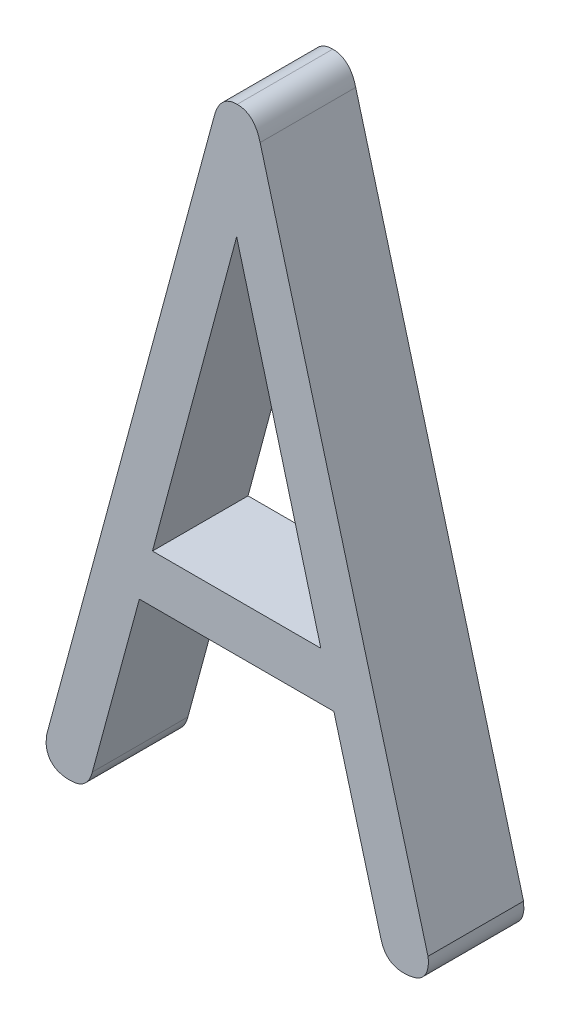
ISO-10303-21;
HEADER;
FILE_DESCRIPTION(('STEP AP214'),'2;1');
FILE_NAME('part.step','',(''),(''),'','','');
FILE_SCHEMA(('AUTOMOTIVE_DESIGN { 1 0 10303 214 1 1 1 1 }'));
ENDSEC;
DATA;
#1=APPLICATION_CONTEXT('core data for automotive mechanical design processes');
#2=APPLICATION_PROTOCOL_DEFINITION('international standard','automotive_design',2000,#1);
#3=PRODUCT_CONTEXT('',#1,'mechanical');
#4=PRODUCT('Part','Part','',(#3));
#5=PRODUCT_RELATED_PRODUCT_CATEGORY('part','',(#4));
#6=PRODUCT_DEFINITION_FORMATION('','',#4);
#7=PRODUCT_DEFINITION_CONTEXT('part definition',#1,'design');
#8=PRODUCT_DEFINITION('design','',#6,#7);
#9=PRODUCT_DEFINITION_SHAPE('','',#8);
#10=(LENGTH_UNIT() NAMED_UNIT(*) SI_UNIT(.MILLI.,.METRE.));
#11=(NAMED_UNIT(*) PLANE_ANGLE_UNIT() SI_UNIT($,.RADIAN.));
#12=(NAMED_UNIT(*) SI_UNIT($,.STERADIAN.) SOLID_ANGLE_UNIT());
#13=UNCERTAINTY_MEASURE_WITH_UNIT(LENGTH_MEASURE(1.E-05),#10,'distance_accuracy_value','');
#14=(GEOMETRIC_REPRESENTATION_CONTEXT(3) GLOBAL_UNCERTAINTY_ASSIGNED_CONTEXT((#13)) GLOBAL_UNIT_ASSIGNED_CONTEXT((#10,
#11,#12)) REPRESENTATION_CONTEXT('',''));
#15=CARTESIAN_POINT('',(0.,0.,0.));
#16=DIRECTION('',(0.,0.,1.));
#17=DIRECTION('',(1.,0.,0.));
#18=AXIS2_PLACEMENT_3D('',#15,#16,#17);
#19=CARTESIAN_POINT('',(0.,0.,-0.1));
#20=DIRECTION('',(0.,0.,1.));
#21=DIRECTION('',(1.,0.,0.));
#22=AXIS2_PLACEMENT_3D('',#19,#20,#21);
#23=PLANE('',#22);
#24=DIRECTION('',(0.261903540202846,0.965094055327882,0.));
#25=VECTOR('',#24,1.);
#26=CARTESIAN_POINT('',(20.1106650390394,-17.8358804040573,-0.1));
#27=LINE('',#26,#25);
#28=CARTESIAN_POINT('',(20.1106650390394,-17.8358804040573,-0.1));
#29=VERTEX_POINT('',#28);
#30=CARTESIAN_POINT('',(20.1598750390394,-17.6545454040573,-0.1));
#31=VERTEX_POINT('',#30);
#32=EDGE_CURVE('E164',#29,#31,#27,.T.);
#33=ORIENTED_EDGE('',*,*,#32,.F.);
#34=CARTESIAN_POINT('',(20.1106650390394,-17.8358804040573,-0.1));
#35=CARTESIAN_POINT('',(20.110253619552,-17.8374563353685,-0.1));
#36=CARTESIAN_POINT('',(20.1097585789858,-17.8390194229056,-0.1));
#37=CARTESIAN_POINT('',(20.108532581737,-17.8420789013523,-0.1));
#38=CARTESIAN_POINT('',(20.1077977575629,-17.8435737066957,-0.1));
#39=CARTESIAN_POINT('',(20.1056862930101,-17.846952963104,-0.1));
#40=CARTESIAN_POINT('',(20.1041708798908,-17.8487592820702,-0.1));
#41=CARTESIAN_POINT('',(20.1005757527915,-17.8517136238384,-0.1));
#42=CARTESIAN_POINT('',(20.0984938587695,-17.8528590489901,-0.1));
#43=CARTESIAN_POINT('',(20.094863887115,-17.8541397479878,-0.1));
#44=CARTESIAN_POINT('',(20.0933814192367,-17.8544876638293,-0.1));
#45=CARTESIAN_POINT('',(20.0903927115968,-17.8549282606182,-0.1));
#46=CARTESIAN_POINT('',(20.0888868736959,-17.8550235323658,-0.1));
#47=CARTESIAN_POINT('',(20.0873900390394,-17.8550254040573,-0.1));
#48=B_SPLINE_CURVE_WITH_KNOTS('',3,(#34,#35,#36,#37,#38,#39,#40,#41,#42,#43,#44,#45,#46,#47),
.UNSPECIFIED.,.F.,.F.,(4,2,2,2,2,2,4),(0.,0.00489593289724349,0.00987509630168829,
0.0168135520722736,0.0237790969314097,0.0283263346560344,0.0328267579917053),.UNSPECIFIED.);
#49=CARTESIAN_POINT('',(20.0873900390394,-17.8550254040573,-0.1));
#50=VERTEX_POINT('',#49);
#51=EDGE_CURVE('E176',#29,#50,#48,.T.);
#52=ORIENTED_EDGE('',*,*,#51,.T.);
#53=CARTESIAN_POINT('',(20.0873900390394,-17.8550254040573,-0.1));
#54=CARTESIAN_POINT('',(20.0852298062539,-17.8550148694073,-0.1));
#55=CARTESIAN_POINT('',(20.083030667278,-17.8548885285468,-0.1));
#56=CARTESIAN_POINT('',(20.0786515543959,-17.8542159421212,-0.1));
#57=CARTESIAN_POINT('',(20.0764732186483,-17.8536599891219,-0.1));
#58=CARTESIAN_POINT('',(20.0724715026934,-17.851975339587,-0.1));
#59=CARTESIAN_POINT('',(20.0706346470294,-17.850883147428,-0.1));
#60=CARTESIAN_POINT('',(20.0674671155835,-17.8480995101172,-0.1));
#61=CARTESIAN_POINT('',(20.0661384816064,-17.8464056993797,-0.1));
#62=CARTESIAN_POINT('',(20.0638918910791,-17.8423014546028,-0.1));
#63=CARTESIAN_POINT('',(20.063122212447,-17.8398152294405,-0.1));
#64=CARTESIAN_POINT('',(20.0623552595867,-17.8355446149797,-0.1));
#65=CARTESIAN_POINT('',(20.0621932427029,-17.8337795165057,-0.1));
#66=CARTESIAN_POINT('',(20.0621152346911,-17.8311454974348,-0.1));
#67=CARTESIAN_POINT('',(20.0621159033885,-17.8302787136915,-0.1));
#68=CARTESIAN_POINT('',(20.0621241695021,-17.8285462062788,-0.1));
#69=CARTESIAN_POINT('',(20.0621317582252,-17.8276804826436,-0.1));
#70=CARTESIAN_POINT('',(20.0621200390394,-17.8268154040573,-0.1));
#71=B_SPLINE_CURVE_WITH_KNOTS('',3,(#53,#54,#55,#56,#57,#58,#59,#60,#61,#62,#63,#64,#65,#66,#67,
#68,#69,#70),.UNSPECIFIED.,.F.,.F.,(4,2,2,2,2,2,2,2,4),(0.,0.00654059190832742,
0.0132334570773786,0.0195233027432859,0.0258381591979918,0.0335014709844825,0.038808154833169,
0.04140792847835,0.0440044407075193),.UNSPECIFIED.);
#72=CARTESIAN_POINT('',(20.0626100390394,-17.8268154040573,-0.1));
#73=VERTEX_POINT('',#72);
#74=EDGE_CURVE('E214',#50,#73,#71,.T.);
#75=ORIENTED_EDGE('',*,*,#74,.T.);
#76=DIRECTION('',(-0.261850708185428,-0.965108391126504,0.));
#77=VECTOR('',#76,1.);
#78=CARTESIAN_POINT('',(20.2382225390394,-17.1775479040573,-0.1));
#79=LINE('',#78,#77);
#80=CARTESIAN_POINT('',(20.2382225390394,-17.1775479040573,-0.1));
#81=VERTEX_POINT('',#80);
#82=EDGE_CURVE('E180',#81,#73,#79,.T.);
#83=ORIENTED_EDGE('',*,*,#82,.F.);
#84=CARTESIAN_POINT('',(20.2382225390394,-17.1775479040573,-0.1));
#85=CARTESIAN_POINT('',(20.2392771319383,-17.1734731389393,-0.1));
#86=CARTESIAN_POINT('',(20.2408877114756,-17.16917801034,-0.1));
#87=CARTESIAN_POINT('',(20.2446488760711,-17.1633337321534,-0.1));
#88=CARTESIAN_POINT('',(20.2462745534382,-17.1613954989765,-0.1));
#89=CARTESIAN_POINT('',(20.2491699612069,-17.15899032813,-0.1));
#90=CARTESIAN_POINT('',(20.2502173571279,-17.1582700850096,-0.1));
#91=CARTESIAN_POINT('',(20.2524350794429,-17.1570419929953,-0.1));
#92=CARTESIAN_POINT('',(20.2536059224604,-17.1565350849027,-0.1));
#93=CARTESIAN_POINT('',(20.2560085887822,-17.15574982955,-0.1));
#94=CARTESIAN_POINT('',(20.2572397927617,-17.1554695317049,-0.1));
#95=CARTESIAN_POINT('',(20.2597267478246,-17.1551065889253,-0.1));
#96=CARTESIAN_POINT('',(20.2609823813303,-17.1550231596254,-0.1));
#97=CARTESIAN_POINT('',(20.2622325390394,-17.1550254040573,-0.1));
#98=B_SPLINE_CURVE_WITH_KNOTS('',3,(#84,#85,#86,#87,#88,#89,#90,#91,#92,#93,#94,#95,#96,#97),
.UNSPECIFIED.,.F.,.F.,(4,2,2,2,2,2,4),(0.,0.0131013214293937,0.0206037974132024,
0.0243913711162785,0.0281954771881149,0.0319664793386956,0.035722431474066),.UNSPECIFIED.);
#99=CARTESIAN_POINT('',(20.2622325390394,-17.1550254040573,-0.1));
#100=VERTEX_POINT('',#99);
#101=EDGE_CURVE('E183',#81,#100,#98,.T.);
#102=ORIENTED_EDGE('',*,*,#101,.T.);
#103=CARTESIAN_POINT('',(20.2622325390394,-17.1550254040573,-0.1));
#104=CARTESIAN_POINT('',(20.2634988803877,-17.1550264201773,-0.1));
#105=CARTESIAN_POINT('',(20.2647693988123,-17.1551107414599,-0.1));
#106=CARTESIAN_POINT('',(20.2672832576649,-17.1554813477658,-0.1));
#107=CARTESIAN_POINT('',(20.2685265095693,-17.1557682120668,-0.1));
#108=CARTESIAN_POINT('',(20.2721560469159,-17.1569872002523,-0.1));
#109=CARTESIAN_POINT('',(20.2744360472493,-17.1582780352938,-0.1));
#110=CARTESIAN_POINT('',(20.2781144146828,-17.1613825127454,-0.1));
#111=CARTESIAN_POINT('',(20.2795852516271,-17.1631160455485,-0.1));
#112=CARTESIAN_POINT('',(20.2831002327065,-17.168363449883,-0.1));
#113=CARTESIAN_POINT('',(20.2846543184006,-17.1721880039859,-0.1));
#114=CARTESIAN_POINT('',(20.285953905302,-17.1766107396209,-0.1));
#115=CARTESIAN_POINT('',(20.286101621992,-17.1771404022241,-0.1));
#116=CARTESIAN_POINT('',(20.2862425390394,-17.1776704040573,-0.1));
#117=B_SPLINE_CURVE_WITH_KNOTS('',3,(#103,#104,#105,#106,#107,#108,#109,#110,#111,#112,#113,
#114,#115,#116),.UNSPECIFIED.,.F.,.F.,(4,2,2,2,2,2,4),(0.,0.00380161390964727,
0.00761414479348842,0.0152563515518174,0.0219926736752459,0.0341458441735124,
0.0357947586552457),.UNSPECIFIED.);
#118=CARTESIAN_POINT('',(20.2862425390394,-17.1776704040573,-0.1));
#119=VERTEX_POINT('',#118);
#120=EDGE_CURVE('E186',#100,#119,#117,.T.);
#121=ORIENTED_EDGE('',*,*,#120,.T.);
#122=DIRECTION('',(-0.261663187921532,0.965159249081073,0.));
#123=VECTOR('',#122,1.);
#124=CARTESIAN_POINT('',(20.4613300390394,-17.8234904040573,-0.1));
#125=LINE('',#124,#123);
#126=CARTESIAN_POINT('',(20.4618375390394,-17.8272441540573,-0.1));
#127=VERTEX_POINT('',#126);
#128=EDGE_CURVE('E217',#127,#119,#125,.T.);
#129=ORIENTED_EDGE('',*,*,#128,.F.);
#130=CARTESIAN_POINT('',(20.4623450390394,-17.8272441540573,-0.1));
#131=CARTESIAN_POINT('',(20.4623334189568,-17.828202741424,-0.1));
#132=CARTESIAN_POINT('',(20.462343127518,-17.8291620784035,-0.1));
#133=CARTESIAN_POINT('',(20.4623469573402,-17.8310840282883,-0.1));
#134=CARTESIAN_POINT('',(20.4623410231976,-17.8320466407451,-0.1));
#135=CARTESIAN_POINT('',(20.4622095479624,-17.8349719951084,-0.1));
#136=CARTESIAN_POINT('',(20.4619658441171,-17.8369319327547,-0.1));
#137=CARTESIAN_POINT('',(20.4609969666172,-17.8410278824722,-0.1));
#138=CARTESIAN_POINT('',(20.4602115820293,-17.8431522371422,-0.1));
#139=CARTESIAN_POINT('',(20.4579036724689,-17.8470073378161,-0.1));
#140=CARTESIAN_POINT('',(20.4563756392941,-17.848734998281,-0.1));
#141=CARTESIAN_POINT('',(20.4530023387878,-17.8513345684555,-0.1));
#142=CARTESIAN_POINT('',(20.4512109810788,-17.852280086179,-0.1));
#143=CARTESIAN_POINT('',(20.4461864315793,-17.8542008120593,-0.1));
#144=CARTESIAN_POINT('',(20.4428064787639,-17.8547522657958,-0.1));
#145=CARTESIAN_POINT('',(20.4384525303043,-17.8549986788034,-0.1));
#146=CARTESIAN_POINT('',(20.4374718457132,-17.855023690351,-0.1));
#147=CARTESIAN_POINT('',(20.4364975390394,-17.8550254040573,-0.1));
#148=B_SPLINE_CURVE_WITH_KNOTS('',3,(#130,#131,#132,#133,#134,#135,#136,#137,#138,#139,#140,
#141,#142,#143,#144,#145,#146,#147),.UNSPECIFIED.,.F.,.F.,(4,2,2,2,2,2,2,2,4),(0.,
0.00287719821914431,0.00576460064393809,0.0116600137686082,0.0183464029317022,0.025083159660862,
0.03107347383393,0.041169196435357,0.0441066430272821),.UNSPECIFIED.);
#149=CARTESIAN_POINT('',(20.4364975390394,-17.8550254040573,-0.1));
#150=VERTEX_POINT('',#149);
#151=EDGE_CURVE('E91',#127,#150,#148,.T.);
#152=ORIENTED_EDGE('',*,*,#151,.T.);
#153=CARTESIAN_POINT('',(20.4364975390394,-17.8550254040573,-0.1));
#154=CARTESIAN_POINT('',(20.4348293269025,-17.8550237141066,-0.1));
#155=CARTESIAN_POINT('',(20.4331478024926,-17.8549121755159,-0.1));
#156=CARTESIAN_POINT('',(20.4298171988279,-17.8543894936207,-0.1));
#157=CARTESIAN_POINT('',(20.4281686213318,-17.8539753243675,-0.1));
#158=CARTESIAN_POINT('',(20.4244481500918,-17.8525534502684,-0.1));
#159=CARTESIAN_POINT('',(20.4224287770881,-17.8513892744711,-0.1));
#160=CARTESIAN_POINT('',(20.4189360337703,-17.8484468816847,-0.1));
#161=CARTESIAN_POINT('',(20.4174624467612,-17.8466689089362,-0.1));
#162=CARTESIAN_POINT('',(20.4146008454989,-17.8420818841496,-0.1));
#163=CARTESIAN_POINT('',(20.4134252126975,-17.8391301267109,-0.1));
#164=CARTESIAN_POINT('',(20.4126800390394,-17.8361954040573,-0.1));
#165=B_SPLINE_CURVE_WITH_KNOTS('',3,(#153,#154,#155,#156,#157,#158,#159,#160,#161,#162,#163,
#164),.UNSPECIFIED.,.F.,.F.,(4,2,2,2,2,4),(0.,0.0050205333909895,0.0100919652889132,
0.0169295536998718,0.0237644244450069,0.0330032001079443),.UNSPECIFIED.);
#166=CARTESIAN_POINT('',(20.4126800390394,-17.8361954040573,-0.1));
#167=VERTEX_POINT('',#166);
#168=EDGE_CURVE('E24',#150,#167,#165,.T.);
#169=ORIENTED_EDGE('',*,*,#168,.T.);
#170=DIRECTION('',(0.261913518822734,-0.965091347312726,0.));
#171=VECTOR('',#170,1.);
#172=CARTESIAN_POINT('',(20.3633825390394,-17.6545454040573,-0.1));
#173=LINE('',#172,#171);
#174=CARTESIAN_POINT('',(20.3633825390394,-17.6545454040573,-0.1));
#175=VERTEX_POINT('',#174);
#176=EDGE_CURVE('E195',#175,#167,#173,.T.);
#177=ORIENTED_EDGE('',*,*,#176,.F.);
#178=DIRECTION('',(1.,0.,0.));
#179=VECTOR('',#178,1.);
#180=CARTESIAN_POINT('',(20.1598750390394,-17.6545454040573,-0.1));
#181=LINE('',#180,#179);
#182=EDGE_CURVE('E103',#31,#175,#181,.T.);
#183=ORIENTED_EDGE('',*,*,#182,.F.);
#184=EDGE_LOOP('',(#33,#52,#75,#83,#102,#121,#129,#152,#169,#177,#183));
#185=FACE_BOUND('',#184,.T.);
#186=DIRECTION('',(-0.258708678620981,0.965955392140955,0.));
#187=VECTOR('',#186,1.);
#188=CARTESIAN_POINT('',(20.2616550390394,-17.2752854040573,-0.1));
#189=LINE('',#188,#187);
#190=CARTESIAN_POINT('',(20.3497325390394,-17.6041454040573,-0.1));
#191=VERTEX_POINT('',#190);
#192=CARTESIAN_POINT('',(20.2616550390394,-17.2752854040573,-0.1));
#193=VERTEX_POINT('',#192);
#194=EDGE_CURVE('E145',#191,#193,#189,.T.);
#195=ORIENTED_EDGE('',*,*,#194,.T.);
#196=DIRECTION('',(-0.258708678620962,-0.96595539214096,0.));
#197=VECTOR('',#196,1.);
#198=CARTESIAN_POINT('',(20.1735775390394,-17.6041454040573,-0.1));
#199=LINE('',#198,#197);
#200=CARTESIAN_POINT('',(20.1735775390394,-17.6041454040573,-0.1));
#201=VERTEX_POINT('',#200);
#202=EDGE_CURVE('E142',#193,#201,#199,.T.);
#203=ORIENTED_EDGE('',*,*,#202,.T.);
#204=DIRECTION('',(1.,0.,0.));
#205=VECTOR('',#204,1.);
#206=CARTESIAN_POINT('',(20.3497325390394,-17.6041454040573,-0.1));
#207=LINE('',#206,#205);
#208=EDGE_CURVE('E203',#201,#191,#207,.T.);
#209=ORIENTED_EDGE('',*,*,#208,.T.);
#210=EDGE_LOOP('',(#195,#203,#209));
#211=FACE_BOUND('',#210,.T.);
#212=ADVANCED_FACE('F17',(#185,#211),#23,.F.);
#213=CARTESIAN_POINT('',(20.3497325390394,-17.6041454040573,-0.1));
#214=DIRECTION('',(0.,-1.,0.));
#215=DIRECTION('',(0.,0.,-1.));
#216=AXIS2_PLACEMENT_3D('',#213,#214,#215);
#217=PLANE('',#216);
#218=DIRECTION('',(0.,0.,1.));
#219=VECTOR('',#218,1.);
#220=CARTESIAN_POINT('',(20.3497325390394,-17.6041454040573,-0.1));
#221=LINE('',#220,#219);
#222=CARTESIAN_POINT('',(20.3497325390394,-17.6041454040573,0.));
#223=VERTEX_POINT('',#222);
#224=EDGE_CURVE('E152',#223,#191,#221,.F.);
#225=ORIENTED_EDGE('',*,*,#224,.T.);
#226=ORIENTED_EDGE('',*,*,#208,.F.);
#227=DIRECTION('',(0.,0.,1.));
#228=VECTOR('',#227,1.);
#229=CARTESIAN_POINT('',(20.1735775390394,-17.6041454040573,-0.1));
#230=LINE('',#229,#228);
#231=CARTESIAN_POINT('',(20.1735775390394,-17.6041454040573,0.));
#232=VERTEX_POINT('',#231);
#233=EDGE_CURVE('E200',#201,#232,#230,.T.);
#234=ORIENTED_EDGE('',*,*,#233,.T.);
#235=DIRECTION('',(1.,0.,0.));
#236=VECTOR('',#235,1.);
#237=CARTESIAN_POINT('',(0.,-17.6041454040573,0.));
#238=LINE('',#237,#236);
#239=EDGE_CURVE('E157',#223,#232,#238,.F.);
#240=ORIENTED_EDGE('',*,*,#239,.F.);
#241=EDGE_LOOP('',(#225,#226,#234,#240));
#242=FACE_BOUND('',#241,.T.);
#243=ADVANCED_FACE('F304',(#242),#217,.F.);
#244=CARTESIAN_POINT('',(20.1735775390394,-17.6041454040573,-0.1));
#245=DIRECTION('',(-0.96595539214096,0.258708678620962,0.));
#246=DIRECTION('',(-0.258708678620962,-0.96595539214096,0.));
#247=AXIS2_PLACEMENT_3D('',#244,#245,#246);
#248=PLANE('',#247);
#249=ORIENTED_EDGE('',*,*,#233,.F.);
#250=ORIENTED_EDGE('',*,*,#202,.F.);
#251=DIRECTION('',(0.,0.,1.));
#252=VECTOR('',#251,1.);
#253=CARTESIAN_POINT('',(20.2616550390394,-17.2752854040573,-0.1));
#254=LINE('',#253,#252);
#255=CARTESIAN_POINT('',(20.2616550390394,-17.2752854040573,0.));
#256=VERTEX_POINT('',#255);
#257=EDGE_CURVE('E135',#193,#256,#254,.T.);
#258=ORIENTED_EDGE('',*,*,#257,.T.);
#259=DIRECTION('',(0.258708678620975,0.965955392140957,0.));
#260=VECTOR('',#259,1.);
#261=CARTESIAN_POINT('',(20.1735775390394,-17.6041454040573,0.));
#262=LINE('',#261,#260);
#263=EDGE_CURVE('E140',#232,#256,#262,.T.);
#264=ORIENTED_EDGE('',*,*,#263,.F.);
#265=EDGE_LOOP('',(#249,#250,#258,#264));
#266=FACE_BOUND('',#265,.T.);
#267=ADVANCED_FACE('F138',(#266),#248,.F.);
#268=CARTESIAN_POINT('',(20.2616550390394,-17.2752854040573,-0.1));
#269=DIRECTION('',(0.965955392140955,0.258708678620981,0.));
#270=DIRECTION('',(-0.258708678620981,0.965955392140955,0.));
#271=AXIS2_PLACEMENT_3D('',#268,#269,#270);
#272=PLANE('',#271);
#273=ORIENTED_EDGE('',*,*,#257,.F.);
#274=ORIENTED_EDGE('',*,*,#194,.F.);
#275=ORIENTED_EDGE('',*,*,#224,.F.);
#276=DIRECTION('',(0.258708678620975,-0.965955392140957,0.));
#277=VECTOR('',#276,1.);
#278=CARTESIAN_POINT('',(20.2616550390394,-17.2752854040573,0.));
#279=LINE('',#278,#277);
#280=EDGE_CURVE('E149',#256,#223,#279,.T.);
#281=ORIENTED_EDGE('',*,*,#280,.F.);
#282=EDGE_LOOP('',(#273,#274,#275,#281));
#283=FACE_BOUND('',#282,.T.);
#284=ADVANCED_FACE('F150',(#283),#272,.F.);
#285=CARTESIAN_POINT('',(20.1598750390394,-17.6545454040573,-0.1));
#286=DIRECTION('',(0.,-1.,0.));
#287=DIRECTION('',(0.,0.,-1.));
#288=AXIS2_PLACEMENT_3D('',#285,#286,#287);
#289=PLANE('',#288);
#290=ORIENTED_EDGE('',*,*,#182,.T.);
#291=DIRECTION('',(0.,0.,1.));
#292=VECTOR('',#291,1.);
#293=CARTESIAN_POINT('',(20.3633825390394,-17.6545454040573,-0.1));
#294=LINE('',#293,#292);
#295=CARTESIAN_POINT('',(20.3633825390394,-17.6545454040573,0.));
#296=VERTEX_POINT('',#295);
#297=EDGE_CURVE('E192',#296,#175,#294,.F.);
#298=ORIENTED_EDGE('',*,*,#297,.F.);
#299=DIRECTION('',(1.,0.,0.));
#300=VECTOR('',#299,1.);
#301=CARTESIAN_POINT('',(0.,-17.6545454040573,0.));
#302=LINE('',#301,#300);
#303=CARTESIAN_POINT('',(20.1598750390394,-17.6545454040573,0.));
#304=VERTEX_POINT('',#303);
#305=EDGE_CURVE('E154',#304,#296,#302,.T.);
#306=ORIENTED_EDGE('',*,*,#305,.F.);
#307=DIRECTION('',(0.,0.,1.));
#308=VECTOR('',#307,1.);
#309=CARTESIAN_POINT('',(20.1598750390394,-17.6545454040573,-0.1));
#310=LINE('',#309,#308);
#311=EDGE_CURVE('E159',#31,#304,#310,.T.);
#312=ORIENTED_EDGE('',*,*,#311,.F.);
#313=EDGE_LOOP('',(#290,#298,#306,#312));
#314=FACE_BOUND('',#313,.T.);
#315=ADVANCED_FACE('F371',(#314),#289,.T.);
#316=CARTESIAN_POINT('',(20.3633825390394,-17.6545454040573,-0.1));
#317=DIRECTION('',(-0.965091347312726,-0.261913518822734,0.));
#318=DIRECTION('',(0.261913518822734,-0.965091347312726,0.));
#319=AXIS2_PLACEMENT_3D('',#316,#317,#318);
#320=PLANE('',#319);
#321=ORIENTED_EDGE('',*,*,#176,.T.);
#322=DIRECTION('',(0.,0.,1.));
#323=VECTOR('',#322,1.);
#324=CARTESIAN_POINT('',(20.4126800390394,-17.8361954040573,-0.05));
#325=LINE('',#324,#323);
#326=CARTESIAN_POINT('',(20.4126800390394,-17.8361954040573,0.));
#327=VERTEX_POINT('',#326);
#328=EDGE_CURVE('E190',#167,#327,#325,.T.);
#329=ORIENTED_EDGE('',*,*,#328,.T.);
#330=DIRECTION('',(0.261913518822729,-0.965091347312728,0.));
#331=VECTOR('',#330,1.);
#332=CARTESIAN_POINT('',(20.3633825390394,-17.6545454040573,0.));
#333=LINE('',#332,#331);
#334=EDGE_CURVE('E172',#296,#327,#333,.T.);
#335=ORIENTED_EDGE('',*,*,#334,.F.);
#336=ORIENTED_EDGE('',*,*,#297,.T.);
#337=EDGE_LOOP('',(#321,#329,#335,#336));
#338=FACE_BOUND('',#337,.T.);
#339=ADVANCED_FACE('F370',(#338),#320,.T.);
#340=CARTESIAN_POINT('',(20.4126800390394,-17.8361954040573,-0.1));
#341=CARTESIAN_POINT('',(20.4177550390394,-17.8550254040573,-0.1));
#342=CARTESIAN_POINT('',(20.4364975390394,-17.8550254040573,-0.1));
#343=CARTESIAN_POINT('',(20.4126800390394,-17.8361954040573,0.));
#344=CARTESIAN_POINT('',(20.4177550390394,-17.8550254040573,0.));
#345=CARTESIAN_POINT('',(20.4364975390394,-17.8550254040573,0.));
#346=B_SPLINE_SURFACE_WITH_KNOTS('',1,2,((#340,#341,#342),(#343,#344,#345)),.UNSPECIFIED.,.F.,
.F.,.F.,(2,2),(3,3),(0.,1.),(0.,1.),.UNSPECIFIED.);
#347=DIRECTION('',(0.,0.,1.));
#348=VECTOR('',#347,1.);
#349=CARTESIAN_POINT('',(20.4364975390394,-17.8550254040573,-0.05));
#350=LINE('',#349,#348);
#351=CARTESIAN_POINT('',(20.4364975390394,-17.8550254040573,0.));
#352=VERTEX_POINT('',#351);
#353=EDGE_CURVE('E187',#150,#352,#350,.T.);
#354=CARTESIAN_POINT('',(20.4126800390394,-17.8361954040573,0.));
#355=CARTESIAN_POINT('',(20.4131148366523,-17.8377962785117,0.));
#356=CARTESIAN_POINT('',(20.4136422209383,-17.8393830643257,0.));
#357=CARTESIAN_POINT('',(20.414950086615,-17.842474469384,0.));
#358=CARTESIAN_POINT('',(20.4157342653539,-17.8439774883961,0.));
#359=CARTESIAN_POINT('',(20.4179693801817,-17.8473266701374,0.));
#360=CARTESIAN_POINT('',(20.4195603004211,-17.8490878217094,0.));
#361=CARTESIAN_POINT('',(20.4232738462895,-17.8519294217627,0.));
#362=CARTESIAN_POINT('',(20.4253977205605,-17.8530082504555,0.));
#363=CARTESIAN_POINT('',(20.4290588282328,-17.8542048350783,0.));
#364=CARTESIAN_POINT('',(20.4305385131455,-17.8545274133112,0.));
#365=CARTESIAN_POINT('',(20.4335139428493,-17.8549351839945,0.));
#366=CARTESIAN_POINT('',(20.4350092864326,-17.8550231581496,0.));
#367=CARTESIAN_POINT('',(20.4364975390394,-17.8550254040573,0.));
#368=B_SPLINE_CURVE_WITH_KNOTS('',3,(#354,#355,#356,#357,#358,#359,#360,#361,#362,#363,#364,
#365,#366,#367),.UNSPECIFIED.,.F.,.F.,(4,2,2,2,2,2,4),(0.,0.00498912468275578,
0.0100534974503664,0.0170319611891029,0.0240269297556173,0.0285528363750429,0.0330248355606764),.UNSPECIFIED.);
#369=EDGE_CURVE('E269',#327,#352,#368,.T.);
#370=ORIENTED_EDGE('',*,*,#328,.F.);
#371=ORIENTED_EDGE('',*,*,#168,.F.);
#372=ORIENTED_EDGE('',*,*,#353,.T.);
#373=ORIENTED_EDGE('',*,*,#369,.F.);
#374=EDGE_LOOP('',(#370,#371,#372,#373));
#375=FACE_BOUND('',#374,.T.);
#376=ADVANCED_FACE('F280',(#375),#346,.F.);
#377=CARTESIAN_POINT('',(20.4364975390394,-17.8550254040573,-0.1));
#378=CARTESIAN_POINT('',(20.4623450390394,-17.8550254040573,-0.1));
#379=CARTESIAN_POINT('',(20.4623450390394,-17.8309979040573,-0.1));
#380=CARTESIAN_POINT('',(20.4623450390394,-17.8289656028073,-0.1));
#381=CARTESIAN_POINT('',(20.4623450390394,-17.8269333015573,-0.1));
#382=CARTESIAN_POINT('',(20.4364975390394,-17.8550254040573,0.));
#383=CARTESIAN_POINT('',(20.4623450390394,-17.8550254040573,0.));
#384=CARTESIAN_POINT('',(20.4623450390394,-17.8309979040573,0.));
#385=CARTESIAN_POINT('',(20.4623450390394,-17.8289656028073,0.));
#386=CARTESIAN_POINT('',(20.4623450390394,-17.8269333015573,0.));
#387=B_SPLINE_SURFACE_WITH_KNOTS('',1,2,((#377,#378,#379,#380,#381),(#382,#383,#384,#385,#386)),
.UNSPECIFIED.,.F.,.F.,.F.,(2,2),(3,2,3),(0.,1.),(0.,1.,1.08458230152954),.UNSPECIFIED.);
#388=DIRECTION('',(0.,0.,1.));
#389=VECTOR('',#388,1.);
#390=CARTESIAN_POINT('',(20.4623450390394,-17.8272342881153,0.));
#391=LINE('',#390,#389);
#392=CARTESIAN_POINT('',(20.4618375390394,-17.8272441540573,0.));
#393=VERTEX_POINT('',#392);
#394=EDGE_CURVE('E189',#393,#127,#391,.F.);
#395=CARTESIAN_POINT('',(20.4364975390394,-17.8550254040573,0.));
#396=CARTESIAN_POINT('',(20.4402265799229,-17.8550234979573,0.));
#397=CARTESIAN_POINT('',(20.4442713247709,-17.8546451300911,0.));
#398=CARTESIAN_POINT('',(20.4501452015789,-17.8527824265392,0.));
#399=CARTESIAN_POINT('',(20.4521849425388,-17.8518369883298,0.));
#400=CARTESIAN_POINT('',(20.4558310957188,-17.8492427070297,0.));
#401=CARTESIAN_POINT('',(20.4574341821343,-17.8475886993975,0.));
#402=CARTESIAN_POINT('',(20.459764688286,-17.8440302896162,0.));
#403=CARTESIAN_POINT('',(20.4605685759753,-17.8421729090678,0.));
#404=CARTESIAN_POINT('',(20.4616242159664,-17.8386274187496,0.));
#405=CARTESIAN_POINT('',(20.4619414200209,-17.8369566217694,0.));
#406=CARTESIAN_POINT('',(20.4622992092677,-17.8335825850466,0.));
#407=CARTESIAN_POINT('',(20.4623383115757,-17.8318792198759,0.));
#408=CARTESIAN_POINT('',(20.4623489053717,-17.8291980707562,0.));
#409=CARTESIAN_POINT('',(20.4623420786115,-17.8282197956238,0.));
#410=CARTESIAN_POINT('',(20.4623450390394,-17.8272441540573,0.));
#411=B_SPLINE_CURVE_WITH_KNOTS('',3,(#395,#396,#397,#398,#399,#400,#401,#402,#403,#404,#405,
#406,#407,#408,#409,#410),.UNSPECIFIED.,.F.,.F.,(4,2,2,2,2,2,2,4),(0.,0.0116098131736922,
0.0182812397968937,0.0250021425660761,0.0309896165229147,0.0360650434445708,0.0411675132253161,
0.0440999473004294),.UNSPECIFIED.);
#412=EDGE_CURVE('E268',#352,#393,#411,.T.);
#413=ORIENTED_EDGE('',*,*,#353,.F.);
#414=ORIENTED_EDGE('',*,*,#151,.F.);
#415=ORIENTED_EDGE('',*,*,#394,.F.);
#416=ORIENTED_EDGE('',*,*,#412,.F.);
#417=EDGE_LOOP('',(#413,#414,#415,#416));
#418=FACE_BOUND('',#417,.T.);
#419=ADVANCED_FACE('F274',(#418),#387,.F.);
#420=CARTESIAN_POINT('',(20.4613300390394,-17.8234904040573,-0.1));
#421=DIRECTION('',(0.965159249081073,0.261663187921532,0.));
#422=DIRECTION('',(-0.261663187921532,0.965159249081073,0.));
#423=AXIS2_PLACEMENT_3D('',#420,#421,#422);
#424=PLANE('',#423);
#425=ORIENTED_EDGE('',*,*,#128,.T.);
#426=DIRECTION('',(0.,0.,1.));
#427=VECTOR('',#426,1.);
#428=CARTESIAN_POINT('',(20.2862425390394,-17.1776704040573,-0.05));
#429=LINE('',#428,#427);
#430=CARTESIAN_POINT('',(20.2862425390394,-17.1776704040573,0.));
#431=VERTEX_POINT('',#430);
#432=EDGE_CURVE('E184',#119,#431,#429,.T.);
#433=ORIENTED_EDGE('',*,*,#432,.T.);
#434=DIRECTION('',(-0.261663187921531,0.965159249081074,0.));
#435=VECTOR('',#434,1.);
#436=CARTESIAN_POINT('',(20.4613300390394,-17.8234904040573,0.));
#437=LINE('',#436,#435);
#438=EDGE_CURVE('E336',#393,#431,#437,.T.);
#439=ORIENTED_EDGE('',*,*,#438,.F.);
#440=ORIENTED_EDGE('',*,*,#394,.T.);
#441=EDGE_LOOP('',(#425,#433,#439,#440));
#442=FACE_BOUND('',#441,.T.);
#443=ADVANCED_FACE('F279',(#442),#424,.T.);
#444=CARTESIAN_POINT('',(20.2862425390394,-17.1776704040573,-0.1));
#445=CARTESIAN_POINT('',(20.2802400390394,-17.1550254040573,-0.1));
#446=CARTESIAN_POINT('',(20.2622325390394,-17.1550254040573,-0.1));
#447=CARTESIAN_POINT('',(20.2862425390394,-17.1776704040573,0.));
#448=CARTESIAN_POINT('',(20.2802400390394,-17.1550254040573,0.));
#449=CARTESIAN_POINT('',(20.2622325390394,-17.1550254040573,0.));
#450=B_SPLINE_SURFACE_WITH_KNOTS('',1,2,((#444,#445,#446),(#447,#448,#449)),.UNSPECIFIED.,.F.,
.F.,.F.,(2,2),(3,3),(0.,1.),(0.,1.),.UNSPECIFIED.);
#451=DIRECTION('',(0.,0.,1.));
#452=VECTOR('',#451,1.);
#453=CARTESIAN_POINT('',(20.2622325390394,-17.1550254040573,-0.05));
#454=LINE('',#453,#452);
#455=CARTESIAN_POINT('',(20.2622325390394,-17.1550254040573,0.));
#456=VERTEX_POINT('',#455);
#457=EDGE_CURVE('E181',#100,#456,#454,.T.);
#458=CARTESIAN_POINT('',(20.2862425390394,-17.1776704040573,0.));
#459=CARTESIAN_POINT('',(20.2851864131865,-17.1735802794899,0.));
#460=CARTESIAN_POINT('',(20.2835806467206,-17.1692637672436,0.));
#461=CARTESIAN_POINT('',(20.2798249198515,-17.1633904920814,0.));
#462=CARTESIAN_POINT('',(20.2782034527575,-17.1614439701847,0.));
#463=CARTESIAN_POINT('',(20.2753120386315,-17.1590245149504,0.));
#464=CARTESIAN_POINT('',(20.2742654431144,-17.1582991213273,0.));
#465=CARTESIAN_POINT('',(20.2720480007661,-17.1570614806399,0.));
#466=CARTESIAN_POINT('',(20.2708766410219,-17.1565501596816,0.));
#467=CARTESIAN_POINT('',(20.2684710919656,-17.1557574741326,0.));
#468=CARTESIAN_POINT('',(20.2672374883305,-17.1554742807016,0.));
#469=CARTESIAN_POINT('',(20.2647448470386,-17.1551074402772,0.));
#470=CARTESIAN_POINT('',(20.2634859204423,-17.1550230584578,0.));
#471=CARTESIAN_POINT('',(20.2622325390394,-17.1550254040573,0.));
#472=B_SPLINE_CURVE_WITH_KNOTS('',3,(#458,#459,#460,#461,#462,#463,#464,#465,#466,#467,#468,
#469,#470,#471),.UNSPECIFIED.,.F.,.F.,(4,2,2,2,2,2,4),(0.,0.0131535275612983,0.0206675648824021,
0.0244618302820714,0.0282723446616596,0.0320519983170037,0.0358176599582377),.UNSPECIFIED.);
#473=EDGE_CURVE('E256',#431,#456,#472,.T.);
#474=ORIENTED_EDGE('',*,*,#432,.F.);
#475=ORIENTED_EDGE('',*,*,#120,.F.);
#476=ORIENTED_EDGE('',*,*,#457,.T.);
#477=ORIENTED_EDGE('',*,*,#473,.F.);
#478=EDGE_LOOP('',(#474,#475,#476,#477));
#479=FACE_BOUND('',#478,.T.);
#480=ADVANCED_FACE('F285',(#479),#450,.F.);
#481=CARTESIAN_POINT('',(20.2622325390394,-17.1550254040573,-0.1));
#482=CARTESIAN_POINT('',(20.2442250390394,-17.1550254040573,-0.1));
#483=CARTESIAN_POINT('',(20.2382225390394,-17.1775479040573,-0.1));
#484=CARTESIAN_POINT('',(20.2622325390394,-17.1550254040573,0.));
#485=CARTESIAN_POINT('',(20.2442250390394,-17.1550254040573,0.));
#486=CARTESIAN_POINT('',(20.2382225390394,-17.1775479040573,0.));
#487=B_SPLINE_SURFACE_WITH_KNOTS('',1,2,((#481,#482,#483),(#484,#485,#486)),.UNSPECIFIED.,.F.,
.F.,.F.,(2,2),(3,3),(0.,1.),(0.,1.),.UNSPECIFIED.);
#488=DIRECTION('',(0.,0.,1.));
#489=VECTOR('',#488,1.);
#490=CARTESIAN_POINT('',(20.2382225390394,-17.1775479040573,-0.1));
#491=LINE('',#490,#489);
#492=CARTESIAN_POINT('',(20.2382225390394,-17.1775479040573,0.));
#493=VERTEX_POINT('',#492);
#494=EDGE_CURVE('E177',#493,#81,#491,.F.);
#495=CARTESIAN_POINT('',(20.2622325390394,-17.1550254040573,0.));
#496=CARTESIAN_POINT('',(20.2609614511358,-17.1550264836686,0.));
#497=CARTESIAN_POINT('',(20.2596861468546,-17.1551109371531,0.));
#498=CARTESIAN_POINT('',(20.2571626073059,-17.1554824721884,0.));
#499=CARTESIAN_POINT('',(20.2559144647489,-17.1557701610124,0.));
#500=CARTESIAN_POINT('',(20.252270526231,-17.1569934732458,0.));
#501=CARTESIAN_POINT('',(20.2499813822339,-17.1582896666304,0.));
#502=CARTESIAN_POINT('',(20.246294283264,-17.1614056491104,0.));
#503=CARTESIAN_POINT('',(20.2448222184402,-17.1631436209981,0.));
#504=CARTESIAN_POINT('',(20.2413116243764,-17.1683971891244,0.));
#505=CARTESIAN_POINT('',(20.239762269988,-17.1722224567051,0.));
#506=CARTESIAN_POINT('',(20.2384835580807,-17.1765923875293,0.));
#507=CARTESIAN_POINT('',(20.2383502489417,-17.1770699839984,0.));
#508=CARTESIAN_POINT('',(20.2382225390394,-17.1775479040573,0.));
#509=B_SPLINE_CURVE_WITH_KNOTS('',3,(#495,#496,#497,#498,#499,#500,#501,#502,#503,#504,#505,
#506,#507,#508),.UNSPECIFIED.,.F.,.F.,(4,2,2,2,2,2,4),(0.,0.00381590843167283,
0.00764326740340988,0.0153154017907327,0.0220639355261664,0.034212144603471,0.0356991780130995),.UNSPECIFIED.);
#510=EDGE_CURVE('E250',#456,#493,#509,.T.);
#511=ORIENTED_EDGE('',*,*,#457,.F.);
#512=ORIENTED_EDGE('',*,*,#101,.F.);
#513=ORIENTED_EDGE('',*,*,#494,.F.);
#514=ORIENTED_EDGE('',*,*,#510,.F.);
#515=EDGE_LOOP('',(#511,#512,#513,#514));
#516=FACE_BOUND('',#515,.T.);
#517=ADVANCED_FACE('F350',(#516),#487,.F.);
#518=CARTESIAN_POINT('',(20.2382225390394,-17.1775479040573,-0.1));
#519=DIRECTION('',(-0.965108391126504,0.261850708185428,0.));
#520=DIRECTION('',(-0.261850708185428,-0.965108391126504,0.));
#521=AXIS2_PLACEMENT_3D('',#518,#519,#520);
#522=PLANE('',#521);
#523=ORIENTED_EDGE('',*,*,#82,.T.);
#524=DIRECTION('',(0.,0.,1.));
#525=VECTOR('',#524,1.);
#526=CARTESIAN_POINT('',(20.0621200390394,-17.8266124096534,-0.1));
#527=LINE('',#526,#525);
#528=CARTESIAN_POINT('',(20.0626100390394,-17.8268154040573,0.));
#529=VERTEX_POINT('',#528);
#530=EDGE_CURVE('E380',#73,#529,#527,.T.);
#531=ORIENTED_EDGE('',*,*,#530,.T.);
#532=DIRECTION('',(-0.261850708185422,-0.965108391126506,0.));
#533=VECTOR('',#532,1.);
#534=CARTESIAN_POINT('',(20.2382225390394,-17.1775479040573,0.));
#535=LINE('',#534,#533);
#536=EDGE_CURVE('E355',#493,#529,#535,.T.);
#537=ORIENTED_EDGE('',*,*,#536,.F.);
#538=ORIENTED_EDGE('',*,*,#494,.T.);
#539=EDGE_LOOP('',(#523,#531,#537,#538));
#540=FACE_BOUND('',#539,.T.);
#541=ADVANCED_FACE('F384',(#540),#522,.T.);
#542=CARTESIAN_POINT('',(20.0621200390394,-17.8264997740573,-0.1));
#543=CARTESIAN_POINT('',(20.0621200390394,-17.8285650890573,-0.1));
#544=CARTESIAN_POINT('',(20.0621200390394,-17.8306304040573,-0.1));
#545=CARTESIAN_POINT('',(20.0621200390394,-17.8550254040573,-0.1));
#546=CARTESIAN_POINT('',(20.0873900390394,-17.8550254040573,-0.1));
#547=CARTESIAN_POINT('',(20.0621200390394,-17.8264997740573,0.));
#548=CARTESIAN_POINT('',(20.0621200390394,-17.8285650890573,0.));
#549=CARTESIAN_POINT('',(20.0621200390394,-17.8306304040573,0.));
#550=CARTESIAN_POINT('',(20.0621200390394,-17.8550254040573,0.));
#551=CARTESIAN_POINT('',(20.0873900390394,-17.8550254040573,0.));
#552=B_SPLINE_SURFACE_WITH_KNOTS('',1,2,((#542,#543,#544,#545,#546),(#547,#548,#549,#550,#551)),
.UNSPECIFIED.,.F.,.F.,.F.,(2,2),(3,2,3),(0.,1.),(-0.0846614060258026,0.,1.),.UNSPECIFIED.);
#553=DIRECTION('',(0.,0.,1.));
#554=VECTOR('',#553,1.);
#555=CARTESIAN_POINT('',(20.0873900390394,-17.8550254040573,-0.05));
#556=LINE('',#555,#554);
#557=CARTESIAN_POINT('',(20.0873900390394,-17.8550254040573,0.));
#558=VERTEX_POINT('',#557);
#559=EDGE_CURVE('E165',#50,#558,#556,.T.);
#560=CARTESIAN_POINT('',(20.0621200390394,-17.8268154040573,0.));
#561=CARTESIAN_POINT('',(20.0621305862546,-17.8278365985383,0.));
#562=CARTESIAN_POINT('',(20.0621203302917,-17.8288586071362,0.));
#563=CARTESIAN_POINT('',(20.0621197465903,-17.8309066295007,0.));
#564=CARTESIAN_POINT('',(20.0621295009115,-17.8319326424687,0.));
#565=CARTESIAN_POINT('',(20.0622845916843,-17.835052710785,0.));
#566=CARTESIAN_POINT('',(20.0625608431865,-17.8371435242388,0.));
#567=CARTESIAN_POINT('',(20.0636152364105,-17.8413466725291,0.));
#568=CARTESIAN_POINT('',(20.0644220576992,-17.8434529847567,0.));
#569=CARTESIAN_POINT('',(20.066760065008,-17.8472709594263,0.));
#570=CARTESIAN_POINT('',(20.0682966958002,-17.8489795091356,0.));
#571=CARTESIAN_POINT('',(20.0716863967421,-17.8515450206434,0.));
#572=CARTESIAN_POINT('',(20.0734877738154,-17.8524737223948,0.));
#573=CARTESIAN_POINT('',(20.0784916884706,-17.8543209999997,0.));
#574=CARTESIAN_POINT('',(20.0818328667984,-17.8548265240697,0.));
#575=CARTESIAN_POINT('',(20.0859037565537,-17.8550090321716,0.));
#576=CARTESIAN_POINT('',(20.0866486143527,-17.8550245380942,0.));
#577=CARTESIAN_POINT('',(20.0873900390394,-17.8550254040573,0.));
#578=B_SPLINE_CURVE_WITH_KNOTS('',3,(#560,#561,#562,#563,#564,#565,#566,#567,#568,#569,#570,
#571,#572,#573,#574,#575,#576,#577),.UNSPECIFIED.,.F.,.F.,(4,2,2,2,2,2,2,2,4),(0.,
0.00306511470411081,0.00614282420203551,0.0124336328197018,0.0190959969560177,
0.0258088659704099,0.0318009512289192,0.0417566562582977,0.0439891540511233),.UNSPECIFIED.);
#579=EDGE_CURVE('E231',#529,#558,#578,.T.);
#580=ORIENTED_EDGE('',*,*,#530,.F.);
#581=ORIENTED_EDGE('',*,*,#74,.F.);
#582=ORIENTED_EDGE('',*,*,#559,.T.);
#583=ORIENTED_EDGE('',*,*,#579,.F.);
#584=EDGE_LOOP('',(#580,#581,#582,#583));
#585=FACE_BOUND('',#584,.T.);
#586=ADVANCED_FACE('F379',(#585),#552,.F.);
#587=CARTESIAN_POINT('',(20.0873900390394,-17.8550254040573,-0.1));
#588=CARTESIAN_POINT('',(20.1057125390394,-17.8550254040573,-0.1));
#589=CARTESIAN_POINT('',(20.1106650390394,-17.8358804040573,-0.1));
#590=CARTESIAN_POINT('',(20.0873900390394,-17.8550254040573,0.));
#591=CARTESIAN_POINT('',(20.1057125390394,-17.8550254040573,0.));
#592=CARTESIAN_POINT('',(20.1106650390394,-17.8358804040573,0.));
#593=B_SPLINE_SURFACE_WITH_KNOTS('',1,2,((#587,#588,#589),(#590,#591,#592)),.UNSPECIFIED.,.F.,
.F.,.F.,(2,2),(3,3),(0.,1.),(0.,1.),.UNSPECIFIED.);
#594=DIRECTION('',(0.,0.,1.));
#595=VECTOR('',#594,1.);
#596=CARTESIAN_POINT('',(20.1106650390394,-17.8358804040573,-0.1));
#597=LINE('',#596,#595);
#598=CARTESIAN_POINT('',(20.1106650390394,-17.8358804040573,0.));
#599=VERTEX_POINT('',#598);
#600=EDGE_CURVE('E44',#599,#29,#597,.F.);
#601=CARTESIAN_POINT('',(20.0873900390394,-17.8550254040573,0.));
#602=CARTESIAN_POINT('',(20.0890355107449,-17.8550248656501,0.));
#603=CARTESIAN_POINT('',(20.0906956479909,-17.8549083906146,0.));
#604=CARTESIAN_POINT('',(20.0939753194655,-17.8543665513128,0.));
#605=CARTESIAN_POINT('',(20.0955944322595,-17.8539387676056,0.));
#606=CARTESIAN_POINT('',(20.0992110476273,-17.8524872618586,0.));
#607=CARTESIAN_POINT('',(20.1011543872934,-17.8513122520809,0.));
#608=CARTESIAN_POINT('',(20.104503410906,-17.8483871974301,0.));
#609=CARTESIAN_POINT('',(20.1059098279183,-17.846637942696,0.));
#610=CARTESIAN_POINT('',(20.1087455926276,-17.8419853798456,0.));
#611=CARTESIAN_POINT('',(20.1099180734168,-17.8389112799591,0.));
#612=CARTESIAN_POINT('',(20.1106650390394,-17.8358804040573,0.));
#613=B_SPLINE_CURVE_WITH_KNOTS('',3,(#601,#602,#603,#604,#605,#606,#607,#608,#609,#610,#611,
#612),.UNSPECIFIED.,.F.,.F.,(4,2,2,2,2,4),(0.,0.00495415730221606,0.0099472343924898,
0.0166074548038503,0.0232585491518798,0.032806813724925),.UNSPECIFIED.);
#614=EDGE_CURVE('E35',#558,#599,#613,.T.);
#615=ORIENTED_EDGE('',*,*,#559,.F.);
#616=ORIENTED_EDGE('',*,*,#51,.F.);
#617=ORIENTED_EDGE('',*,*,#600,.F.);
#618=ORIENTED_EDGE('',*,*,#614,.F.);
#619=EDGE_LOOP('',(#615,#616,#617,#618));
#620=FACE_BOUND('',#619,.T.);
#621=ADVANCED_FACE('F19',(#620),#593,.F.);
#622=CARTESIAN_POINT('',(20.1106650390394,-17.8358804040573,-0.1));
#623=DIRECTION('',(0.965094055327882,-0.261903540202846,0.));
#624=DIRECTION('',(0.261903540202846,0.965094055327882,0.));
#625=AXIS2_PLACEMENT_3D('',#622,#623,#624);
#626=PLANE('',#625);
#627=ORIENTED_EDGE('',*,*,#32,.T.);
#628=ORIENTED_EDGE('',*,*,#311,.T.);
#629=DIRECTION('',(0.261903540202859,0.965094055327878,0.));
#630=VECTOR('',#629,1.);
#631=CARTESIAN_POINT('',(20.1106650390394,-17.8358804040573,0.));
#632=LINE('',#631,#630);
#633=EDGE_CURVE('E11',#599,#304,#632,.T.);
#634=ORIENTED_EDGE('',*,*,#633,.F.);
#635=ORIENTED_EDGE('',*,*,#600,.T.);
#636=EDGE_LOOP('',(#627,#628,#634,#635));
#637=FACE_BOUND('',#636,.T.);
#638=ADVANCED_FACE('F236',(#637),#626,.T.);
#639=CARTESIAN_POINT('',(0.,0.,0.));
#640=DIRECTION('',(0.,0.,1.));
#641=DIRECTION('',(1.,0.,0.));
#642=AXIS2_PLACEMENT_3D('',#639,#640,#641);
#643=PLANE('',#642);
#644=ORIENTED_EDGE('',*,*,#614,.T.);
#645=ORIENTED_EDGE('',*,*,#633,.T.);
#646=ORIENTED_EDGE('',*,*,#305,.T.);
#647=ORIENTED_EDGE('',*,*,#334,.T.);
#648=ORIENTED_EDGE('',*,*,#369,.T.);
#649=ORIENTED_EDGE('',*,*,#412,.T.);
#650=ORIENTED_EDGE('',*,*,#438,.T.);
#651=ORIENTED_EDGE('',*,*,#473,.T.);
#652=ORIENTED_EDGE('',*,*,#510,.T.);
#653=ORIENTED_EDGE('',*,*,#536,.T.);
#654=ORIENTED_EDGE('',*,*,#579,.T.);
#655=EDGE_LOOP('',(#644,#645,#646,#647,#648,#649,#650,#651,#652,#653,#654));
#656=FACE_BOUND('',#655,.T.);
#657=ORIENTED_EDGE('',*,*,#263,.T.);
#658=ORIENTED_EDGE('',*,*,#280,.T.);
#659=ORIENTED_EDGE('',*,*,#239,.T.);
#660=EDGE_LOOP('',(#657,#658,#659));
#661=FACE_BOUND('',#660,.T.);
#662=ADVANCED_FACE('F156',(#656,#661),#643,.T.);
#663=CLOSED_SHELL('',(#212,#243,#267,#284,#315,#339,#376,#419,#443,#480,#517,#541,#586,#621,
#638,#662));
#664=MANIFOLD_SOLID_BREP('B1',#663);
#665=ADVANCED_BREP_SHAPE_REPRESENTATION('',(#18,#664),#14);
#666=SHAPE_DEFINITION_REPRESENTATION(#9,#665);
ENDSEC;
END-ISO-10303-21;
